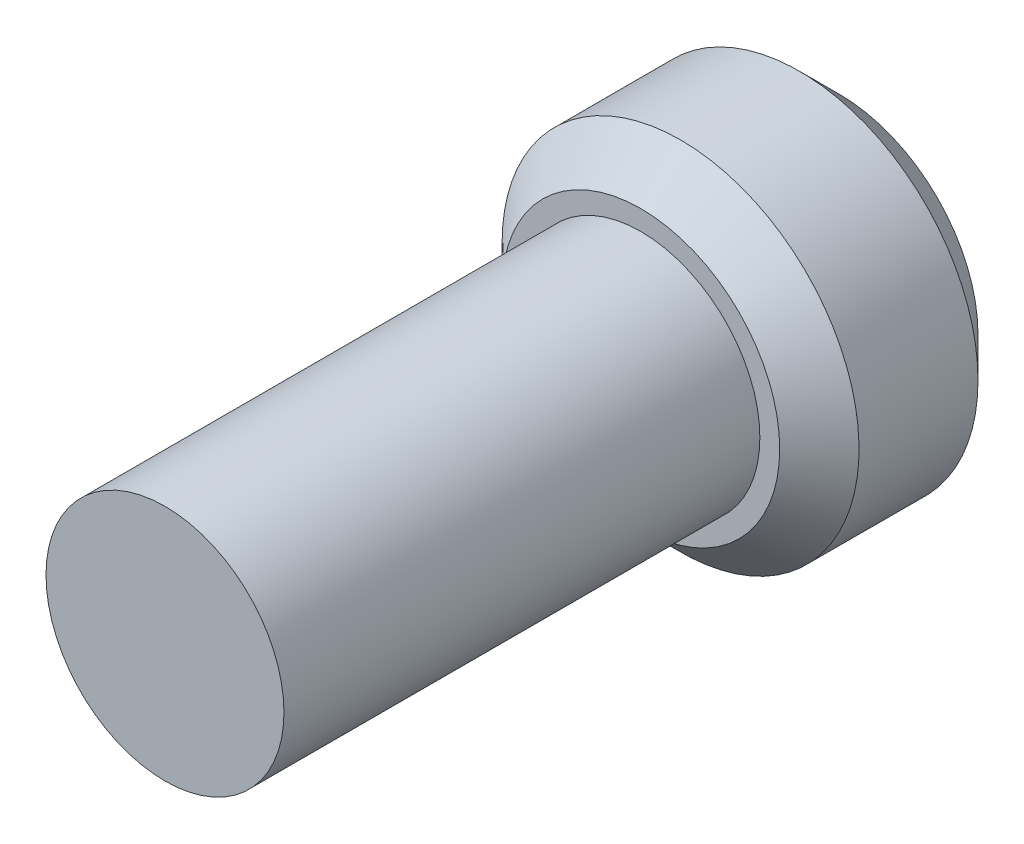
ISO-10303-21;
HEADER;
FILE_DESCRIPTION(('STEP AP214'),'2;1');
FILE_NAME('part.step','',(''),(''),'','','');
FILE_SCHEMA(('AUTOMOTIVE_DESIGN { 1 0 10303 214 1 1 1 1 }'));
ENDSEC;
DATA;
#1=APPLICATION_CONTEXT('core data for automotive mechanical design processes');
#2=APPLICATION_PROTOCOL_DEFINITION('international standard','automotive_design',2000,#1);
#3=PRODUCT_CONTEXT('',#1,'mechanical');
#4=PRODUCT('Part','Part','',(#3));
#5=PRODUCT_RELATED_PRODUCT_CATEGORY('part','',(#4));
#6=PRODUCT_DEFINITION_FORMATION('','',#4);
#7=PRODUCT_DEFINITION_CONTEXT('part definition',#1,'design');
#8=PRODUCT_DEFINITION('design','',#6,#7);
#9=PRODUCT_DEFINITION_SHAPE('','',#8);
#10=(LENGTH_UNIT() NAMED_UNIT(*) SI_UNIT(.MILLI.,.METRE.));
#11=(NAMED_UNIT(*) PLANE_ANGLE_UNIT() SI_UNIT($,.RADIAN.));
#12=(NAMED_UNIT(*) SI_UNIT($,.STERADIAN.) SOLID_ANGLE_UNIT());
#13=UNCERTAINTY_MEASURE_WITH_UNIT(LENGTH_MEASURE(1.E-05),#10,'distance_accuracy_value','');
#14=(GEOMETRIC_REPRESENTATION_CONTEXT(3) GLOBAL_UNCERTAINTY_ASSIGNED_CONTEXT((#13)) GLOBAL_UNIT_ASSIGNED_CONTEXT((#10,
#11,#12)) REPRESENTATION_CONTEXT('',''));
#15=CARTESIAN_POINT('',(0.,0.,0.));
#16=DIRECTION('',(0.,0.,1.));
#17=DIRECTION('',(1.,0.,0.));
#18=AXIS2_PLACEMENT_3D('',#15,#16,#17);
#19=CARTESIAN_POINT('',(-1.299038106,-1.5,1.5));
#20=DIRECTION('',(0.,0.,1.));
#21=DIRECTION('',(1.,0.,0.));
#22=AXIS2_PLACEMENT_3D('',#19,#20,#21);
#23=PLANE('',#22);
#24=DIRECTION('',(-0.866025403838329,0.499999999906659,0.));
#25=VECTOR('',#24,1.);
#26=CARTESIAN_POINT('',(0.,-1.5,1.5));
#27=LINE('',#26,#25);
#28=CARTESIAN_POINT('',(-1.299038105988,-0.750000000006928,1.5));
#29=VERTEX_POINT('',#28);
#30=CARTESIAN_POINT('',(-5.44638257218606E-10,-1.49999999968555,1.5));
#31=VERTEX_POINT('',#30);
#32=EDGE_CURVE('E85',#29,#31,#27,.F.);
#33=ORIENTED_EDGE('',*,*,#32,.F.);
#34=DIRECTION('',(0.,1.,0.));
#35=VECTOR('',#34,1.);
#36=CARTESIAN_POINT('',(-1.299038106,-0.75,1.5));
#37=LINE('',#36,#35);
#38=CARTESIAN_POINT('',(-1.299038106,0.750000000006928,1.5));
#39=VERTEX_POINT('',#38);
#40=EDGE_CURVE('E132',#39,#29,#37,.F.);
#41=ORIENTED_EDGE('',*,*,#40,.F.);
#42=DIRECTION('',(0.866025403838329,0.499999999906659,0.));
#43=VECTOR('',#42,1.);
#44=CARTESIAN_POINT('',(-1.299038106,0.75,1.5));
#45=LINE('',#44,#43);
#46=CARTESIAN_POINT('',(5.44638352086296E-10,1.49999999968555,1.5));
#47=VERTEX_POINT('',#46);
#48=EDGE_CURVE('E126',#47,#39,#45,.F.);
#49=ORIENTED_EDGE('',*,*,#48,.F.);
#50=DIRECTION('',(0.866025403838329,-0.499999999906659,0.));
#51=VECTOR('',#50,1.);
#52=CARTESIAN_POINT('',(0.,1.5,1.5));
#53=LINE('',#52,#51);
#54=CARTESIAN_POINT('',(1.299038105988,0.750000000006928,1.5));
#55=VERTEX_POINT('',#54);
#56=EDGE_CURVE('E74',#55,#47,#53,.F.);
#57=ORIENTED_EDGE('',*,*,#56,.F.);
#58=DIRECTION('',(0.,1.,0.));
#59=VECTOR('',#58,1.);
#60=CARTESIAN_POINT('',(1.299038106,0.75,1.5));
#61=LINE('',#60,#59);
#62=CARTESIAN_POINT('',(1.299038106,-0.750000000006928,1.5));
#63=VERTEX_POINT('',#62);
#64=EDGE_CURVE('E71',#63,#55,#61,.T.);
#65=ORIENTED_EDGE('',*,*,#64,.F.);
#66=DIRECTION('',(-0.866025403838329,-0.499999999906659,0.));
#67=VECTOR('',#66,1.);
#68=CARTESIAN_POINT('',(1.299038106,-0.75,1.5));
#69=LINE('',#68,#67);
#70=EDGE_CURVE('E68',#31,#63,#69,.F.);
#71=ORIENTED_EDGE('',*,*,#70,.F.);
#72=EDGE_LOOP('',(#33,#41,#49,#57,#65,#71));
#73=FACE_BOUND('',#72,.T.);
#74=ADVANCED_FACE('F17',(#73),#23,.F.);
#75=CARTESIAN_POINT('',(1.299038106,0.75,0.));
#76=DIRECTION('',(-1.,0.,0.));
#77=DIRECTION('',(0.,0.,1.));
#78=AXIS2_PLACEMENT_3D('',#75,#76,#77);
#79=PLANE('',#78);
#80=DIRECTION('',(0.,1.,0.));
#81=VECTOR('',#80,1.);
#82=CARTESIAN_POINT('',(1.299038105952,-1.771,0.));
#83=LINE('',#82,#81);
#84=CARTESIAN_POINT('',(1.299038105976,0.750000000013856,0.));
#85=VERTEX_POINT('',#84);
#86=CARTESIAN_POINT('',(1.299038105988,-0.750000000020785,0.));
#87=VERTEX_POINT('',#86);
#88=EDGE_CURVE('E82',#85,#87,#83,.F.);
#89=ORIENTED_EDGE('',*,*,#88,.T.);
#90=DIRECTION('',(0.,0.,1.));
#91=VECTOR('',#90,1.);
#92=CARTESIAN_POINT('',(1.299038106,-0.75,0.));
#93=LINE('',#92,#91);
#94=EDGE_CURVE('E79',#63,#87,#93,.F.);
#95=ORIENTED_EDGE('',*,*,#94,.F.);
#96=ORIENTED_EDGE('',*,*,#64,.T.);
#97=DIRECTION('',(0.,0.,1.));
#98=VECTOR('',#97,1.);
#99=CARTESIAN_POINT('',(1.299038105952,0.750000000027713,0.));
#100=LINE('',#99,#98);
#101=EDGE_CURVE('E119',#85,#55,#100,.T.);
#102=ORIENTED_EDGE('',*,*,#101,.F.);
#103=EDGE_LOOP('',(#89,#95,#96,#102));
#104=FACE_BOUND('',#103,.T.);
#105=ADVANCED_FACE('F80',(#104),#79,.T.);
#106=CARTESIAN_POINT('',(1.299038106,-0.75,0.));
#107=DIRECTION('',(-0.499999999906659,0.866025403838329,0.));
#108=DIRECTION('',(-0.866025403838329,-0.499999999906659,0.));
#109=AXIS2_PLACEMENT_3D('',#106,#107,#108);
#110=PLANE('',#109);
#111=DIRECTION('',(-0.866025403838329,-0.499999999906659,0.));
#112=VECTOR('',#111,1.);
#113=CARTESIAN_POINT('',(1.299038105952,-0.750000000027713,0.));
#114=LINE('',#113,#112);
#115=CARTESIAN_POINT('',(-1.81546044401176E-10,-1.49999999989518,0.));
#116=VERTEX_POINT('',#115);
#117=EDGE_CURVE('E116',#87,#116,#114,.T.);
#118=ORIENTED_EDGE('',*,*,#117,.T.);
#119=DIRECTION('',(0.,0.,1.));
#120=VECTOR('',#119,1.);
#121=CARTESIAN_POINT('',(-7.26184373535166E-10,-1.49999999958074,0.));
#122=LINE('',#121,#120);
#123=EDGE_CURVE('E89',#31,#116,#122,.F.);
#124=ORIENTED_EDGE('',*,*,#123,.F.);
#125=ORIENTED_EDGE('',*,*,#70,.T.);
#126=ORIENTED_EDGE('',*,*,#94,.T.);
#127=EDGE_LOOP('',(#118,#124,#125,#126));
#128=FACE_BOUND('',#127,.T.);
#129=ADVANCED_FACE('F87',(#128),#110,.T.);
#130=CARTESIAN_POINT('',(0.,-1.5,0.));
#131=DIRECTION('',(0.499999999906659,0.866025403838329,0.));
#132=DIRECTION('',(-0.866025403838329,0.499999999906659,0.));
#133=AXIS2_PLACEMENT_3D('',#130,#131,#132);
#134=PLANE('',#133);
#135=DIRECTION('',(-0.866025403838329,0.499999999906659,0.));
#136=VECTOR('',#135,1.);
#137=CARTESIAN_POINT('',(0.,-1.5,0.));
#138=LINE('',#137,#136);
#139=CARTESIAN_POINT('',(-1.299038105964,-0.750000000020785,0.));
#140=VERTEX_POINT('',#139);
#141=EDGE_CURVE('E114',#116,#140,#138,.T.);
#142=ORIENTED_EDGE('',*,*,#141,.T.);
#143=DIRECTION('',(0.,0.,-1.));
#144=VECTOR('',#143,1.);
#145=CARTESIAN_POINT('',(-1.299038106,-0.75,0.));
#146=LINE('',#145,#144);
#147=EDGE_CURVE('E129',#29,#140,#146,.T.);
#148=ORIENTED_EDGE('',*,*,#147,.F.);
#149=ORIENTED_EDGE('',*,*,#32,.T.);
#150=ORIENTED_EDGE('',*,*,#123,.T.);
#151=EDGE_LOOP('',(#142,#148,#149,#150));
#152=FACE_BOUND('',#151,.T.);
#153=ADVANCED_FACE('F137',(#152),#134,.T.);
#154=CARTESIAN_POINT('',(-1.299038106,-0.75,0.));
#155=DIRECTION('',(1.,0.,0.));
#156=DIRECTION('',(0.,0.,-1.));
#157=AXIS2_PLACEMENT_3D('',#154,#155,#156);
#158=PLANE('',#157);
#159=DIRECTION('',(0.,1.,0.));
#160=VECTOR('',#159,1.);
#161=CARTESIAN_POINT('',(-1.299038105952,-1.771,0.));
#162=LINE('',#161,#160);
#163=CARTESIAN_POINT('',(-1.299038105988,0.750000000020785,0.));
#164=VERTEX_POINT('',#163);
#165=EDGE_CURVE('E112',#140,#164,#162,.T.);
#166=ORIENTED_EDGE('',*,*,#165,.T.);
#167=DIRECTION('',(0.,0.,1.));
#168=VECTOR('',#167,1.);
#169=CARTESIAN_POINT('',(-1.299038106,0.75,0.));
#170=LINE('',#169,#168);
#171=EDGE_CURVE('E124',#39,#164,#170,.F.);
#172=ORIENTED_EDGE('',*,*,#171,.F.);
#173=ORIENTED_EDGE('',*,*,#40,.T.);
#174=ORIENTED_EDGE('',*,*,#147,.T.);
#175=EDGE_LOOP('',(#166,#172,#173,#174));
#176=FACE_BOUND('',#175,.T.);
#177=ADVANCED_FACE('F141',(#176),#158,.T.);
#178=CARTESIAN_POINT('',(-1.299038106,0.75,0.));
#179=DIRECTION('',(0.499999999906659,-0.866025403838329,0.));
#180=DIRECTION('',(0.866025403838329,0.499999999906659,0.));
#181=AXIS2_PLACEMENT_3D('',#178,#179,#180);
#182=PLANE('',#181);
#183=DIRECTION('',(0.866025403838329,0.499999999906659,0.));
#184=VECTOR('',#183,1.);
#185=CARTESIAN_POINT('',(-1.299038105952,0.750000000027713,0.));
#186=LINE('',#185,#184);
#187=CARTESIAN_POINT('',(1.81546091835022E-10,1.49999999989518,0.));
#188=VERTEX_POINT('',#187);
#189=EDGE_CURVE('E35',#164,#188,#186,.T.);
#190=ORIENTED_EDGE('',*,*,#189,.T.);
#191=DIRECTION('',(0.,0.,1.));
#192=VECTOR('',#191,1.);
#193=CARTESIAN_POINT('',(7.26184373535166E-10,1.49999999958074,0.));
#194=LINE('',#193,#192);
#195=EDGE_CURVE('E121',#47,#188,#194,.F.);
#196=ORIENTED_EDGE('',*,*,#195,.F.);
#197=ORIENTED_EDGE('',*,*,#48,.T.);
#198=ORIENTED_EDGE('',*,*,#171,.T.);
#199=EDGE_LOOP('',(#190,#196,#197,#198));
#200=FACE_BOUND('',#199,.T.);
#201=ADVANCED_FACE('F143',(#200),#182,.T.);
#202=CARTESIAN_POINT('',(0.,1.5,0.));
#203=DIRECTION('',(-0.499999999906659,-0.866025403838329,0.));
#204=DIRECTION('',(0.866025403838329,-0.499999999906659,0.));
#205=AXIS2_PLACEMENT_3D('',#202,#203,#204);
#206=PLANE('',#205);
#207=DIRECTION('',(0.866025403838329,-0.499999999906659,0.));
#208=VECTOR('',#207,1.);
#209=CARTESIAN_POINT('',(0.,1.5,0.));
#210=LINE('',#209,#208);
#211=EDGE_CURVE('E108',#188,#85,#210,.T.);
#212=ORIENTED_EDGE('',*,*,#211,.T.);
#213=ORIENTED_EDGE('',*,*,#101,.T.);
#214=ORIENTED_EDGE('',*,*,#56,.T.);
#215=ORIENTED_EDGE('',*,*,#195,.T.);
#216=EDGE_LOOP('',(#212,#213,#214,#215));
#217=FACE_BOUND('',#216,.T.);
#218=ADVANCED_FACE('F146',(#217),#206,.T.);
#219=CARTESIAN_POINT('',(-1.771,-1.771,0.));
#220=DIRECTION('',(0.,0.,1.));
#221=DIRECTION('',(1.,0.,0.));
#222=AXIS2_PLACEMENT_3D('',#219,#220,#221);
#223=PLANE('',#222);
#224=CARTESIAN_POINT('',(0.,0.,0.));
#225=DIRECTION('',(0.,0.,1.));
#226=DIRECTION('',(1.,0.,0.));
#227=AXIS2_PLACEMENT_3D('',#224,#225,#226);
#228=CIRCLE('',#227,1.75000000001546);
#229=CARTESIAN_POINT('',(1.75000000001546,0.,0.));
#230=VERTEX_POINT('',#229);
#231=EDGE_CURVE('E20',#230,#230,#228,.T.);
#232=ORIENTED_EDGE('',*,*,#231,.F.);
#233=EDGE_LOOP('',(#232));
#234=FACE_BOUND('',#233,.T.);
#235=ORIENTED_EDGE('',*,*,#189,.F.);
#236=ORIENTED_EDGE('',*,*,#165,.F.);
#237=ORIENTED_EDGE('',*,*,#141,.F.);
#238=ORIENTED_EDGE('',*,*,#117,.F.);
#239=ORIENTED_EDGE('',*,*,#88,.F.);
#240=ORIENTED_EDGE('',*,*,#211,.F.);
#241=EDGE_LOOP('',(#235,#236,#237,#238,#239,#240));
#242=FACE_BOUND('',#241,.T.);
#243=ADVANCED_FACE('F148',(#234,#242),#223,.F.);
#244=CARTESIAN_POINT('',(0.,0.,0.499999999988177));
#245=DIRECTION('',(0.,0.,1.));
#246=DIRECTION('',(1.,0.,0.));
#247=AXIS2_PLACEMENT_3D('',#244,#245,#246);
#248=CONICAL_SURFACE('',#247,2.25000000000364,0.785398163397448);
#249=CARTESIAN_POINT('',(0.,0.,0.499999999999945));
#250=DIRECTION('',(0.,0.,-1.));
#251=DIRECTION('',(-1.,0.,0.));
#252=AXIS2_PLACEMENT_3D('',#249,#250,#251);
#253=CIRCLE('',#252,2.25);
#254=CARTESIAN_POINT('',(-2.25,0.,0.499999999999945));
#255=VERTEX_POINT('',#254);
#256=EDGE_CURVE('E101',#255,#255,#253,.F.);
#257=ORIENTED_EDGE('',*,*,#256,.F.);
#258=EDGE_LOOP('',(#257));
#259=FACE_BOUND('',#258,.T.);
#260=ORIENTED_EDGE('',*,*,#231,.T.);
#261=EDGE_LOOP('',(#260));
#262=FACE_BOUND('',#261,.T.);
#263=ADVANCED_FACE('F150',(#259,#262),#248,.T.);
#264=CARTESIAN_POINT('',(0.,0.,2.));
#265=DIRECTION('',(0.,0.,-1.));
#266=DIRECTION('',(-1.,0.,0.));
#267=AXIS2_PLACEMENT_3D('',#264,#265,#266);
#268=CYLINDRICAL_SURFACE('',#267,2.25);
#269=ORIENTED_EDGE('',*,*,#256,.T.);
#270=EDGE_LOOP('',(#269));
#271=FACE_BOUND('',#270,.T.);
#272=CARTESIAN_POINT('',(0.,0.,2.00000000006639));
#273=DIRECTION('',(0.,0.,-1.));
#274=DIRECTION('',(0.,1.,0.));
#275=AXIS2_PLACEMENT_3D('',#272,#273,#274);
#276=CIRCLE('',#275,2.24999999994679);
#277=CARTESIAN_POINT('',(0.,2.24999999994679,2.00000000006639));
#278=VERTEX_POINT('',#277);
#279=EDGE_CURVE('E97',#278,#278,#276,.F.);
#280=ORIENTED_EDGE('',*,*,#279,.F.);
#281=EDGE_LOOP('',(#280));
#282=FACE_BOUND('',#281,.T.);
#283=ADVANCED_FACE('F158',(#271,#282),#268,.T.);
#284=CARTESIAN_POINT('',(0.,0.,2.00000000018008));
#285=DIRECTION('',(0.,0.,-1.));
#286=DIRECTION('',(-1.,0.,0.));
#287=AXIS2_PLACEMENT_3D('',#284,#285,#286);
#288=CONICAL_SURFACE('',#287,2.24999999983311,0.785398163397448);
#289=ORIENTED_EDGE('',*,*,#279,.T.);
#290=EDGE_LOOP('',(#289));
#291=FACE_BOUND('',#290,.T.);
#292=CARTESIAN_POINT('',(0.,0.,2.50000000005457));
#293=DIRECTION('',(0.,0.,-1.));
#294=DIRECTION('',(-1.,0.,0.));
#295=AXIS2_PLACEMENT_3D('',#292,#293,#294);
#296=CIRCLE('',#295,1.74999999995862);
#297=CARTESIAN_POINT('',(-1.74999999995862,0.,2.50000000005457));
#298=VERTEX_POINT('',#297);
#299=EDGE_CURVE('E95',#298,#298,#296,.F.);
#300=ORIENTED_EDGE('',*,*,#299,.F.);
#301=EDGE_LOOP('',(#300));
#302=FACE_BOUND('',#301,.T.);
#303=ADVANCED_FACE('F177',(#291,#302),#288,.T.);
#304=CARTESIAN_POINT('',(-1.518,-1.518,8.5));
#305=DIRECTION('',(0.,0.,1.));
#306=DIRECTION('',(1.,0.,0.));
#307=AXIS2_PLACEMENT_3D('',#304,#305,#306);
#308=PLANE('',#307);
#309=CARTESIAN_POINT('',(0.,0.,8.5));
#310=DIRECTION('',(0.,0.,-1.));
#311=DIRECTION('',(-1.,0.,0.));
#312=AXIS2_PLACEMENT_3D('',#309,#310,#311);
#313=CIRCLE('',#312,1.5);
#314=CARTESIAN_POINT('',(-1.5,0.,8.5));
#315=VERTEX_POINT('',#314);
#316=EDGE_CURVE('E26',#315,#315,#313,.T.);
#317=ORIENTED_EDGE('',*,*,#316,.F.);
#318=EDGE_LOOP('',(#317));
#319=FACE_BOUND('',#318,.T.);
#320=ADVANCED_FACE('F171',(#319),#308,.T.);
#321=CARTESIAN_POINT('',(-1.771,-1.771,2.5));
#322=DIRECTION('',(0.,0.,1.));
#323=DIRECTION('',(1.,0.,0.));
#324=AXIS2_PLACEMENT_3D('',#321,#322,#323);
#325=PLANE('',#324);
#326=ORIENTED_EDGE('',*,*,#299,.T.);
#327=EDGE_LOOP('',(#326));
#328=FACE_BOUND('',#327,.T.);
#329=CARTESIAN_POINT('',(0.,0.,2.5));
#330=DIRECTION('',(0.,0.,-1.));
#331=DIRECTION('',(-1.,0.,0.));
#332=AXIS2_PLACEMENT_3D('',#329,#330,#331);
#333=CIRCLE('',#332,1.5);
#334=CARTESIAN_POINT('',(-1.5,0.,2.5));
#335=VERTEX_POINT('',#334);
#336=EDGE_CURVE('E11',#335,#335,#333,.F.);
#337=ORIENTED_EDGE('',*,*,#336,.F.);
#338=EDGE_LOOP('',(#337));
#339=FACE_BOUND('',#338,.T.);
#340=ADVANCED_FACE('F165',(#328,#339),#325,.T.);
#341=CARTESIAN_POINT('',(0.,0.,8.5));
#342=DIRECTION('',(0.,0.,-1.));
#343=DIRECTION('',(-1.,0.,0.));
#344=AXIS2_PLACEMENT_3D('',#341,#342,#343);
#345=CYLINDRICAL_SURFACE('',#344,1.5);
#346=ORIENTED_EDGE('',*,*,#336,.T.);
#347=EDGE_LOOP('',(#346));
#348=FACE_BOUND('',#347,.T.);
#349=ORIENTED_EDGE('',*,*,#316,.T.);
#350=EDGE_LOOP('',(#349));
#351=FACE_BOUND('',#350,.T.);
#352=ADVANCED_FACE('F163',(#348,#351),#345,.T.);
#353=CLOSED_SHELL('',(#74,#105,#129,#153,#177,#201,#218,#243,#263,#283,#303,#320,#340,#352));
#354=MANIFOLD_SOLID_BREP('B1',#353);
#355=ADVANCED_BREP_SHAPE_REPRESENTATION('',(#18,#354),#14);
#356=SHAPE_DEFINITION_REPRESENTATION(#9,#355);
ENDSEC;
END-ISO-10303-21;
